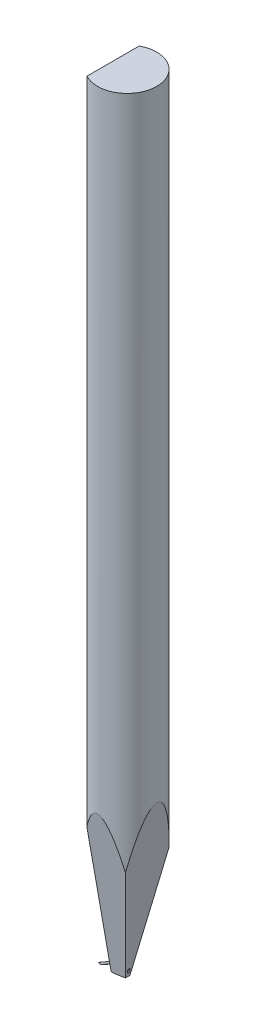
ISO-10303-21;
HEADER;
FILE_DESCRIPTION(('STEP AP214'),'2;1');
FILE_NAME('part.step','',(''),(''),'','','');
FILE_SCHEMA(('AUTOMOTIVE_DESIGN { 1 0 10303 214 1 1 1 1 }'));
ENDSEC;
DATA;
#1=APPLICATION_CONTEXT('core data for automotive mechanical design processes');
#2=APPLICATION_PROTOCOL_DEFINITION('international standard','automotive_design',2000,#1);
#3=PRODUCT_CONTEXT('',#1,'mechanical');
#4=PRODUCT('Part','Part','',(#3));
#5=PRODUCT_RELATED_PRODUCT_CATEGORY('part','',(#4));
#6=PRODUCT_DEFINITION_FORMATION('','',#4);
#7=PRODUCT_DEFINITION_CONTEXT('part definition',#1,'design');
#8=PRODUCT_DEFINITION('design','',#6,#7);
#9=PRODUCT_DEFINITION_SHAPE('','',#8);
#10=(LENGTH_UNIT() NAMED_UNIT(*) SI_UNIT(.MILLI.,.METRE.));
#11=(NAMED_UNIT(*) PLANE_ANGLE_UNIT() SI_UNIT($,.RADIAN.));
#12=(NAMED_UNIT(*) SI_UNIT($,.STERADIAN.) SOLID_ANGLE_UNIT());
#13=UNCERTAINTY_MEASURE_WITH_UNIT(LENGTH_MEASURE(1.E-05),#10,'distance_accuracy_value','');
#14=(GEOMETRIC_REPRESENTATION_CONTEXT(3) GLOBAL_UNCERTAINTY_ASSIGNED_CONTEXT((#13)) GLOBAL_UNIT_ASSIGNED_CONTEXT((#10,
#11,#12)) REPRESENTATION_CONTEXT('',''));
#15=CARTESIAN_POINT('',(0.,0.,0.));
#16=DIRECTION('',(0.,0.,1.));
#17=DIRECTION('',(1.,0.,0.));
#18=AXIS2_PLACEMENT_3D('',#15,#16,#17);
#19=CARTESIAN_POINT('',(-0.794583694095366,-0.0538815367264149,0.));
#20=DIRECTION('',(0.866025403784441,0.499999999999995,0.));
#21=DIRECTION('',(-0.499999999999995,0.866025403784441,0.));
#22=AXIS2_PLACEMENT_3D('',#19,#20,#21);
#23=CYLINDRICAL_SURFACE('',#22,0.0254000000000001);
#24=CARTESIAN_POINT('',(-0.701258134895325,0.,0.));
#25=DIRECTION('',(0.,1.,0.));
#26=DIRECTION('',(1.,0.,0.));
#27=AXIS2_PLACEMENT_3D('',#24,#25,#26);
#28=ELLIPSE('',#27,0.0508000000000007,0.0254000000000001);
#29=CARTESIAN_POINT('',(-0.650458134895325,0.,0.));
#30=VERTEX_POINT('',#29);
#31=EDGE_CURVE('E11',#30,#30,#28,.F.);
#32=ORIENTED_EDGE('',*,*,#31,.F.);
#33=EDGE_LOOP('',(#32));
#34=FACE_BOUND('',#33,.T.);
#35=CARTESIAN_POINT('',(-0.397417456991078,0.175422497178774,0.));
#36=DIRECTION('',(0.866025403784442,0.499999999999995,0.));
#37=DIRECTION('',(-0.499999999999995,0.866025403784442,0.));
#38=AXIS2_PLACEMENT_3D('',#35,#36,#37);
#39=CIRCLE('',#38,0.0254000000000001);
#40=CARTESIAN_POINT('',(-0.410117456991077,0.197419542434898,0.));
#41=VERTEX_POINT('',#40);
#42=EDGE_CURVE('E58',#41,#41,#39,.T.);
#43=ORIENTED_EDGE('',*,*,#42,.F.);
#44=EDGE_LOOP('',(#43));
#45=FACE_BOUND('',#44,.T.);
#46=ADVANCED_FACE('F52',(#34,#45),#23,.T.);
#47=CARTESIAN_POINT('',(-0.397417456991078,0.175422497178774,0.));
#48=DIRECTION('',(0.866025403784442,0.499999999999995,0.));
#49=DIRECTION('',(-0.499999999999995,0.866025403784442,0.));
#50=AXIS2_PLACEMENT_3D('',#47,#48,#49);
#51=PLANE('',#50);
#52=ORIENTED_EDGE('',*,*,#42,.T.);
#53=EDGE_LOOP('',(#52));
#54=FACE_BOUND('',#53,.T.);
#55=ADVANCED_FACE('F64',(#54),#51,.T.);
#56=CARTESIAN_POINT('',(0.,0.,0.));
#57=DIRECTION('',(0.,1.,0.));
#58=DIRECTION('',(0.,0.,1.));
#59=AXIS2_PLACEMENT_3D('',#56,#57,#58);
#60=PLANE('',#59);
#61=ORIENTED_EDGE('',*,*,#31,.T.);
#62=EDGE_LOOP('',(#61));
#63=FACE_BOUND('',#62,.T.);
#64=ADVANCED_FACE('F71',(#63),#60,.F.);
#65=CLOSED_SHELL('',(#46,#55,#64));
#66=MANIFOLD_SOLID_BREP('B2',#65);
#67=CARTESIAN_POINT('',(26.8738719491216,0.,0.0508));
#68=DIRECTION('',(0.,-0.173648177666931,0.984807753012208));
#69=DIRECTION('',(0.,-0.984807753012208,-0.173648177666931));
#70=AXIS2_PLACEMENT_3D('',#67,#68,#69);
#71=PLANE('',#70);
#72=CARTESIAN_POINT('',(-0.3480816,0.02794,0.0557265758409954));
#73=DIRECTION('',(0.,-0.173648177666931,0.984807753012208));
#74=DIRECTION('',(0.,-0.984807753012208,-0.173648177666931));
#75=AXIS2_PLACEMENT_3D('',#72,#73,#74);
#76=ELLIPSE('',#75,0.0283710195360877,0.02794);
#77=CARTESIAN_POINT('',(-0.3480816,0.,0.0508000000000009));
#78=VERTEX_POINT('',#77);
#79=CARTESIAN_POINT('',(-0.37592,0.0255594358987837,0.0553068181606436));
#80=VERTEX_POINT('',#79);
#81=EDGE_CURVE('E123',#78,#80,#76,.F.);
#82=ORIENTED_EDGE('',*,*,#81,.F.);
#83=DIRECTION('',(-1.,0.,0.));
#84=VECTOR('',#83,1.);
#85=CARTESIAN_POINT('',(26.8738719491216,0.,0.0508));
#86=LINE('',#85,#84);
#87=CARTESIAN_POINT('',(-0.287019999999996,0.,0.0508));
#88=VERTEX_POINT('',#87);
#89=EDGE_CURVE('E423',#88,#78,#86,.T.);
#90=ORIENTED_EDGE('',*,*,#89,.F.);
#91=DIRECTION('',(-0.984346441568213,-0.173566836012845,-0.0306045161452665));
#92=VECTOR('',#91,1.);
#93=CARTESIAN_POINT('',(26.0301980698046,4.64043560289492,0.869033999030531));
#94=LINE('',#93,#92);
#95=CARTESIAN_POINT('',(0.0144531636701099,0.0531578527145794,0.060173163670107));
#96=VERTEX_POINT('',#95);
#97=EDGE_CURVE('E414',#96,#88,#94,.T.);
#98=ORIENTED_EDGE('',*,*,#97,.F.);
#99=DIRECTION('',(-0.171087869746036,-0.970287525247814,-0.171087869746036));
#100=VECTOR('',#99,1.);
#101=CARTESIAN_POINT('',(0.791557999082992,4.46033837772866,0.837277999082991));
#102=LINE('',#101,#100);
#103=CARTESIAN_POINT('',(0.537041505266774,3.0169036135559,0.582761505266773));
#104=VERTEX_POINT('',#103);
#105=EDGE_CURVE('E409',#104,#96,#102,.T.);
#106=ORIENTED_EDGE('',*,*,#105,.F.);
#107=CARTESIAN_POINT('',(0.,-0.288101116436578,0.));
#108=DIRECTION('',(0.,-0.173648177666931,0.984807753012208));
#109=DIRECTION('',(0.,-0.984807753012208,-0.173648177666931));
#110=AXIS2_PLACEMENT_3D('',#107,#108,#109);
#111=ELLIPSE('',#110,4.56371043248163,0.792479999999998);
#112=CARTESIAN_POINT('',(-0.37592,3.66844093071415,0.69764511322018));
#113=VERTEX_POINT('',#112);
#114=EDGE_CURVE('E428',#104,#113,#111,.T.);
#115=ORIENTED_EDGE('',*,*,#114,.T.);
#116=DIRECTION('',(0.,0.984807753012208,0.173648177666931));
#117=VECTOR('',#116,1.);
#118=CARTESIAN_POINT('',(-0.37592,20.251112252608,3.62161747949059));
#119=LINE('',#118,#117);
#120=EDGE_CURVE('E109',#80,#113,#119,.T.);
#121=ORIENTED_EDGE('',*,*,#120,.F.);
#122=EDGE_LOOP('',(#82,#90,#98,#106,#115,#121));
#123=FACE_BOUND('',#122,.T.);
#124=ADVANCED_FACE('F101',(#123),#71,.T.);
#125=CARTESIAN_POINT('',(26.8738719491216,0.,-0.0508));
#126=DIRECTION('',(0.,-0.173648177666931,-0.984807753012208));
#127=DIRECTION('',(0.,0.984807753012208,-0.173648177666931));
#128=AXIS2_PLACEMENT_3D('',#125,#126,#127);
#129=PLANE('',#128);
#130=CARTESIAN_POINT('',(-0.3480816,0.02794,-0.0557265758409954));
#131=DIRECTION('',(0.,-0.173648177666931,-0.984807753012208));
#132=DIRECTION('',(0.,0.984807753012208,-0.173648177666931));
#133=AXIS2_PLACEMENT_3D('',#130,#131,#132);
#134=ELLIPSE('',#133,0.0283710195360877,0.02794);
#135=CARTESIAN_POINT('',(-0.37592,0.0255594358987803,-0.055306818160644));
#136=VERTEX_POINT('',#135);
#137=CARTESIAN_POINT('',(-0.3480816,0.,-0.0508000000000009));
#138=VERTEX_POINT('',#137);
#139=EDGE_CURVE('E238',#136,#138,#134,.F.);
#140=ORIENTED_EDGE('',*,*,#139,.F.);
#141=DIRECTION('',(0.,-0.984807753012208,0.173648177666931));
#142=VECTOR('',#141,1.);
#143=CARTESIAN_POINT('',(-0.37592,20.5255765703836,-3.67001294395617));
#144=LINE('',#143,#142);
#145=CARTESIAN_POINT('',(-0.37592,3.66844093071414,-0.69764511322018));
#146=VERTEX_POINT('',#145);
#147=EDGE_CURVE('E234',#146,#136,#144,.T.);
#148=ORIENTED_EDGE('',*,*,#147,.F.);
#149=CARTESIAN_POINT('',(0.,-0.288101116436578,0.));
#150=DIRECTION('',(0.,-0.173648177666931,-0.984807753012208));
#151=DIRECTION('',(0.,-0.984807753012208,0.173648177666931));
#152=AXIS2_PLACEMENT_3D('',#149,#150,#151);
#153=ELLIPSE('',#152,4.56371043248163,0.792479999999998);
#154=CARTESIAN_POINT('',(0.537041505266774,3.0169036135559,-0.582761505266773));
#155=VERTEX_POINT('',#154);
#156=EDGE_CURVE('E431',#146,#155,#153,.T.);
#157=ORIENTED_EDGE('',*,*,#156,.T.);
#158=DIRECTION('',(0.171087869746036,0.970287525247814,-0.171087869746036));
#159=VECTOR('',#158,1.);
#160=CARTESIAN_POINT('',(0.791557999082992,4.46033837772866,-0.837277999082991));
#161=LINE('',#160,#159);
#162=CARTESIAN_POINT('',(0.0144531636701099,0.0531578527145794,-0.060173163670107));
#163=VERTEX_POINT('',#162);
#164=EDGE_CURVE('E274',#163,#155,#161,.T.);
#165=ORIENTED_EDGE('',*,*,#164,.F.);
#166=DIRECTION('',(0.984346441568213,0.173566836012845,-0.0306045161452665));
#167=VECTOR('',#166,1.);
#168=CARTESIAN_POINT('',(26.0301980698046,4.64043560289492,-0.869033999030531));
#169=LINE('',#168,#167);
#170=CARTESIAN_POINT('',(-0.287019999999996,0.,-0.0508));
#171=VERTEX_POINT('',#170);
#172=EDGE_CURVE('E281',#171,#163,#169,.T.);
#173=ORIENTED_EDGE('',*,*,#172,.F.);
#174=DIRECTION('',(-1.,0.,0.));
#175=VECTOR('',#174,1.);
#176=CARTESIAN_POINT('',(26.8738719491216,0.,-0.0508));
#177=LINE('',#176,#175);
#178=EDGE_CURVE('E425',#171,#138,#177,.T.);
#179=ORIENTED_EDGE('',*,*,#178,.T.);
#180=EDGE_LOOP('',(#140,#148,#157,#165,#173,#179));
#181=FACE_BOUND('',#180,.T.);
#182=ADVANCED_FACE('F342',(#181),#129,.T.);
#183=CARTESIAN_POINT('',(0.,0.,0.));
#184=DIRECTION('',(0.,1.,0.));
#185=DIRECTION('',(0.,0.,1.));
#186=AXIS2_PLACEMENT_3D('',#183,#184,#185);
#187=PLANE('',#186);
#188=ORIENTED_EDGE('',*,*,#89,.T.);
#189=DIRECTION('',(0.,0.,-1.));
#190=VECTOR('',#189,1.);
#191=CARTESIAN_POINT('',(-0.3480816,0.,26.4582199752761));
#192=LINE('',#191,#190);
#193=CARTESIAN_POINT('',(-0.348081599999987,0.,0.038143094613822));
#194=VERTEX_POINT('',#193);
#195=EDGE_CURVE('E491',#78,#194,#192,.T.);
#196=ORIENTED_EDGE('',*,*,#195,.T.);
#197=DIRECTION('',(-1.,0.,0.));
#198=VECTOR('',#197,1.);
#199=CARTESIAN_POINT('',(26.7627469491216,0.,0.038143094613822));
#200=LINE('',#199,#198);
#201=CARTESIAN_POINT('',(-0.28702,0.,0.0381430946138281));
#202=VERTEX_POINT('',#201);
#203=EDGE_CURVE('E303',#202,#194,#200,.T.);
#204=ORIENTED_EDGE('',*,*,#203,.F.);
#205=DIRECTION('',(0.,0.,-1.));
#206=VECTOR('',#205,1.);
#207=CARTESIAN_POINT('',(-0.28702,0.,27.2760283406468));
#208=LINE('',#207,#206);
#209=EDGE_CURVE('E412',#88,#202,#208,.T.);
#210=ORIENTED_EDGE('',*,*,#209,.F.);
#211=EDGE_LOOP('',(#188,#196,#204,#210));
#212=FACE_BOUND('',#211,.T.);
#213=ADVANCED_FACE('F351',(#212),#187,.F.);
#214=DIRECTION('',(-1.,0.,0.));
#215=VECTOR('',#214,1.);
#216=CARTESIAN_POINT('',(26.7627469491216,0.,-0.038143094613822));
#217=LINE('',#216,#215);
#218=CARTESIAN_POINT('',(-0.28702,0.,-0.0381430946138281));
#219=VERTEX_POINT('',#218);
#220=CARTESIAN_POINT('',(-0.348081600002256,0.,-0.038143094613822));
#221=VERTEX_POINT('',#220);
#222=EDGE_CURVE('E457',#219,#221,#217,.T.);
#223=ORIENTED_EDGE('',*,*,#222,.T.);
#224=EDGE_CURVE('E490',#221,#138,#192,.T.);
#225=ORIENTED_EDGE('',*,*,#224,.T.);
#226=ORIENTED_EDGE('',*,*,#178,.F.);
#227=EDGE_CURVE('E417',#219,#171,#208,.T.);
#228=ORIENTED_EDGE('',*,*,#227,.F.);
#229=EDGE_LOOP('',(#223,#225,#226,#228));
#230=FACE_BOUND('',#229,.T.);
#231=ADVANCED_FACE('F348',(#230),#187,.F.);
#232=CARTESIAN_POINT('',(-0.28702,0.,27.2760283406468));
#233=DIRECTION('',(-0.173648177666931,0.984807753012208,0.));
#234=DIRECTION('',(-0.984807753012208,-0.173648177666931,0.));
#235=AXIS2_PLACEMENT_3D('',#232,#233,#234);
#236=PLANE('',#235);
#237=ORIENTED_EDGE('',*,*,#209,.T.);
#238=CARTESIAN_POINT('',(-1.63100018413197,-0.236979968,0.));
#239=DIRECTION('',(-0.173648177666931,0.984807753012208,0.));
#240=DIRECTION('',(-0.984807753012208,-0.173648177666931,0.));
#241=AXIS2_PLACEMENT_3D('',#238,#239,#240);
#242=ELLIPSE('',#241,1.38227767906896,0.24003);
#243=CARTESIAN_POINT('',(-0.277365588744476,0.00170233318718376,0.0253999999999992));
#244=VERTEX_POINT('',#243);
#245=EDGE_CURVE('E462',#202,#244,#242,.T.);
#246=ORIENTED_EDGE('',*,*,#245,.T.);
#247=DIRECTION('',(-0.984807753012208,-0.173648177666931,0.));
#248=VECTOR('',#247,1.);
#249=CARTESIAN_POINT('',(-0.28702,0.,0.0253999999999983));
#250=LINE('',#249,#248);
#251=CARTESIAN_POINT('',(-0.12192,0.0291115845149677,0.0253999999999992));
#252=VERTEX_POINT('',#251);
#253=EDGE_CURVE('E294',#252,#244,#250,.T.);
#254=ORIENTED_EDGE('',*,*,#253,.F.);
#255=DIRECTION('',(0.,0.,1.));
#256=VECTOR('',#255,1.);
#257=CARTESIAN_POINT('',(-0.12192,0.0291115845149677,27.2760283406468));
#258=LINE('',#257,#256);
#259=CARTESIAN_POINT('',(-0.12192,0.0291115845149677,-0.0253999999999992));
#260=VERTEX_POINT('',#259);
#261=EDGE_CURVE('E292',#260,#252,#258,.T.);
#262=ORIENTED_EDGE('',*,*,#261,.F.);
#263=DIRECTION('',(-0.984807753012208,-0.173648177666931,0.));
#264=VECTOR('',#263,1.);
#265=CARTESIAN_POINT('',(-0.28702,0.,-0.0253999999999983));
#266=LINE('',#265,#264);
#267=CARTESIAN_POINT('',(-0.277365588744476,0.00170233318718376,-0.0253999999999992));
#268=VERTEX_POINT('',#267);
#269=EDGE_CURVE('E284',#260,#268,#266,.T.);
#270=ORIENTED_EDGE('',*,*,#269,.T.);
#271=EDGE_CURVE('E460',#268,#219,#242,.T.);
#272=ORIENTED_EDGE('',*,*,#271,.T.);
#273=ORIENTED_EDGE('',*,*,#227,.T.);
#274=ORIENTED_EDGE('',*,*,#172,.T.);
#275=DIRECTION('',(0.,0.,-1.));
#276=VECTOR('',#275,1.);
#277=CARTESIAN_POINT('',(0.014453163670107,0.0531578527145792,27.2760283406468));
#278=LINE('',#277,#276);
#279=EDGE_CURVE('E288',#96,#163,#278,.T.);
#280=ORIENTED_EDGE('',*,*,#279,.F.);
#281=ORIENTED_EDGE('',*,*,#97,.T.);
#282=EDGE_LOOP('',(#237,#246,#254,#262,#270,#272,#273,#274,#280,#281));
#283=FACE_BOUND('',#282,.T.);
#284=ADVANCED_FACE('F350',(#283),#236,.F.);
#285=CARTESIAN_POINT('',(0.,21.0312,0.));
#286=DIRECTION('',(0.,-1.,0.));
#287=DIRECTION('',(0.,0.,-1.));
#288=AXIS2_PLACEMENT_3D('',#285,#286,#287);
#289=CYLINDRICAL_SURFACE('',#288,0.792479999999998);
#290=ORIENTED_EDGE('',*,*,#114,.F.);
#291=CARTESIAN_POINT('',(0.,-0.0288101116436568,0.));
#292=DIRECTION('',(-0.984807753012208,0.173648177666931,0.));
#293=DIRECTION('',(-0.173648177666931,-0.984807753012208,0.));
#294=AXIS2_PLACEMENT_3D('',#291,#292,#293);
#295=ELLIPSE('',#294,4.56371043248164,0.792479999999998);
#296=EDGE_CURVE('E407',#104,#155,#295,.T.);
#297=ORIENTED_EDGE('',*,*,#296,.T.);
#298=ORIENTED_EDGE('',*,*,#156,.F.);
#299=DIRECTION('',(0.,-1.,0.));
#300=VECTOR('',#299,1.);
#301=CARTESIAN_POINT('',(-0.37592,21.0312,-0.69764511322018));
#302=LINE('',#301,#300);
#303=CARTESIAN_POINT('',(-0.37592,21.0312,-0.69764511322018));
#304=VERTEX_POINT('',#303);
#305=EDGE_CURVE('E437',#304,#146,#302,.T.);
#306=ORIENTED_EDGE('',*,*,#305,.F.);
#307=CARTESIAN_POINT('',(0.,21.0312,0.));
#308=DIRECTION('',(0.,1.,0.));
#309=DIRECTION('',(0.,0.,1.));
#310=AXIS2_PLACEMENT_3D('',#307,#308,#309);
#311=CIRCLE('',#310,0.792479999999998);
#312=CARTESIAN_POINT('',(-0.37592,21.0312,0.69764511322018));
#313=VERTEX_POINT('',#312);
#314=EDGE_CURVE('E438',#313,#304,#311,.T.);
#315=ORIENTED_EDGE('',*,*,#314,.F.);
#316=DIRECTION('',(0.,-1.,0.));
#317=VECTOR('',#316,1.);
#318=CARTESIAN_POINT('',(-0.37592,21.0312,0.69764511322018));
#319=LINE('',#318,#317);
#320=EDGE_CURVE('E435',#113,#313,#319,.F.);
#321=ORIENTED_EDGE('',*,*,#320,.F.);
#322=EDGE_LOOP('',(#290,#297,#298,#306,#315,#321));
#323=FACE_BOUND('',#322,.T.);
#324=ADVANCED_FACE('F341',(#323),#289,.T.);
#325=CARTESIAN_POINT('',(-0.37592,21.0312,-0.80247998));
#326=DIRECTION('',(-1.,0.,0.));
#327=DIRECTION('',(0.,0.,1.));
#328=AXIS2_PLACEMENT_3D('',#325,#326,#327);
#329=PLANE('',#328);
#330=CARTESIAN_POINT('',(-0.37592,0.,0.0381430946138219));
#331=CARTESIAN_POINT('',(-0.37592,0.0144535575882574,0.0276430142187345));
#332=CARTESIAN_POINT('',(-0.37592,0.0284500319999992,0.014118246623183));
#333=CARTESIAN_POINT('',(-0.37592,0.0284500319999992,-0.0141182466231834));
#334=CARTESIAN_POINT('',(-0.37592,0.0144535575882874,-0.0276430142187765));
#335=CARTESIAN_POINT('',(-0.37592,0.,-0.0381430946138219));
#336=(BOUNDED_CURVE() B_SPLINE_CURVE(3,(#330,#331,#332,#333,#334,#335),.UNSPECIFIED.,.F.,
.F.) B_SPLINE_CURVE_WITH_KNOTS((4,2,4),(1.41121010770958,1.5707963267949,1.73038254588021),
.UNSPECIFIED.) CURVE() GEOMETRIC_REPRESENTATION_ITEM() RATIONAL_B_SPLINE_CURVE((1.,1.,1.,1.,1.,1.)) REPRESENTATION_ITEM(''));
#337=CARTESIAN_POINT('',(-0.375920000000971,0.0255596480208407,-0.011378727190152));
#338=VERTEX_POINT('',#337);
#339=CARTESIAN_POINT('',(-0.375920000000209,0.0255596690697592,0.0115324538400817));
#340=VERTEX_POINT('',#339);
#341=EDGE_CURVE('E221',#338,#340,#336,.F.);
#342=ORIENTED_EDGE('',*,*,#341,.T.);
#343=DIRECTION('',(0.,0.,-1.));
#344=VECTOR('',#343,1.);
#345=CARTESIAN_POINT('',(-0.37592,0.0255594358987817,26.4582199752761));
#346=LINE('',#345,#344);
#347=EDGE_CURVE('E131',#80,#340,#346,.T.);
#348=ORIENTED_EDGE('',*,*,#347,.F.);
#349=ORIENTED_EDGE('',*,*,#120,.T.);
#350=ORIENTED_EDGE('',*,*,#320,.T.);
#351=DIRECTION('',(0.,0.,-1.));
#352=VECTOR('',#351,1.);
#353=CARTESIAN_POINT('',(-0.37592,21.0312,-0.80247998));
#354=LINE('',#353,#352);
#355=EDGE_CURVE('E433',#313,#304,#354,.T.);
#356=ORIENTED_EDGE('',*,*,#355,.T.);
#357=ORIENTED_EDGE('',*,*,#305,.T.);
#358=ORIENTED_EDGE('',*,*,#147,.T.);
#359=EDGE_CURVE('E231',#338,#136,#346,.T.);
#360=ORIENTED_EDGE('',*,*,#359,.F.);
#361=EDGE_LOOP('',(#342,#348,#349,#350,#356,#357,#358,#360));
#362=FACE_BOUND('',#361,.T.);
#363=ADVANCED_FACE('F232',(#362),#329,.T.);
#364=CARTESIAN_POINT('',(0.,21.0312,0.));
#365=DIRECTION('',(0.,1.,0.));
#366=DIRECTION('',(0.,0.,1.));
#367=AXIS2_PLACEMENT_3D('',#364,#365,#366);
#368=PLANE('',#367);
#369=ORIENTED_EDGE('',*,*,#314,.T.);
#370=ORIENTED_EDGE('',*,*,#355,.F.);
#371=EDGE_LOOP('',(#369,#370));
#372=FACE_BOUND('',#371,.T.);
#373=ADVANCED_FACE('F340',(#372),#368,.T.);
#374=CARTESIAN_POINT('',(0.014453163670107,0.0531578527145792,27.2760283406468));
#375=DIRECTION('',(-0.984807753012208,0.173648177666931,0.));
#376=DIRECTION('',(-0.173648177666931,-0.984807753012208,0.));
#377=AXIS2_PLACEMENT_3D('',#374,#375,#376);
#378=PLANE('',#377);
#379=CARTESIAN_POINT('',(0.041004814353714,0.203739746517359,0.));
#380=DIRECTION('',(-0.984807753012208,0.173648177666931,0.));
#381=DIRECTION('',(0.173648177666931,0.984807753012208,0.));
#382=AXIS2_PLACEMENT_3D('',#379,#380,#381);
#383=ELLIPSE('',#382,0.0510507152050236,0.0366689973897193);
#384=CARTESIAN_POINT('',(0.0498696780176598,0.254014886648085,0.));
#385=VERTEX_POINT('',#384);
#386=EDGE_CURVE('E285',#385,#385,#383,.F.);
#387=ORIENTED_EDGE('',*,*,#386,.F.);
#388=EDGE_LOOP('',(#387));
#389=FACE_BOUND('',#388,.T.);
#390=ORIENTED_EDGE('',*,*,#296,.F.);
#391=ORIENTED_EDGE('',*,*,#105,.T.);
#392=ORIENTED_EDGE('',*,*,#279,.T.);
#393=ORIENTED_EDGE('',*,*,#164,.T.);
#394=EDGE_LOOP('',(#390,#391,#392,#393));
#395=FACE_BOUND('',#394,.T.);
#396=ADVANCED_FACE('F346',(#389,#395),#378,.F.);
#397=CARTESIAN_POINT('',(-0.12192,0.0939800000000001,0.0254));
#398=DIRECTION('',(-1.,0.,0.));
#399=DIRECTION('',(0.,0.,1.));
#400=AXIS2_PLACEMENT_3D('',#397,#398,#399);
#401=PLANE('',#400);
#402=ORIENTED_EDGE('',*,*,#261,.T.);
#403=DIRECTION('',(0.,1.,0.));
#404=VECTOR('',#403,1.);
#405=CARTESIAN_POINT('',(-0.12192,0.0939800000000001,0.0254));
#406=LINE('',#405,#404);
#407=CARTESIAN_POINT('',(-0.12192,0.0939800000000001,0.0254));
#408=VERTEX_POINT('',#407);
#409=EDGE_CURVE('E477',#252,#408,#406,.T.);
#410=ORIENTED_EDGE('',*,*,#409,.T.);
#411=CARTESIAN_POINT('',(-0.12192,0.0939800000000001,0.));
#412=DIRECTION('',(1.,0.,0.));
#413=DIRECTION('',(0.,1.,0.));
#414=AXIS2_PLACEMENT_3D('',#411,#412,#413);
#415=ELLIPSE('',#414,0.0293293936748329,0.0254);
#416=CARTESIAN_POINT('',(-0.12192,0.0939800000000001,-0.0253999999999983));
#417=VERTEX_POINT('',#416);
#418=EDGE_CURVE('E467',#417,#408,#415,.F.);
#419=ORIENTED_EDGE('',*,*,#418,.F.);
#420=DIRECTION('',(0.,1.,0.));
#421=VECTOR('',#420,1.);
#422=CARTESIAN_POINT('',(-0.12192,0.0939800000000001,-0.0254));
#423=LINE('',#422,#421);
#424=EDGE_CURVE('E475',#260,#417,#423,.T.);
#425=ORIENTED_EDGE('',*,*,#424,.F.);
#426=EDGE_LOOP('',(#402,#410,#419,#425));
#427=FACE_BOUND('',#426,.T.);
#428=ADVANCED_FACE('F369',(#427),#401,.T.);
#429=CARTESIAN_POINT('',(0.,0.,0.0254));
#430=DIRECTION('',(0.,0.,-1.));
#431=DIRECTION('',(-1.,0.,0.));
#432=AXIS2_PLACEMENT_3D('',#429,#430,#431);
#433=PLANE('',#432);
#434=DIRECTION('',(-1.,0.,0.));
#435=VECTOR('',#434,1.);
#436=CARTESIAN_POINT('',(26.7627469491216,0.00170233318716383,0.0254));
#437=LINE('',#436,#435);
#438=CARTESIAN_POINT('',(-0.311437157476142,0.00170233318716177,0.0254));
#439=VERTEX_POINT('',#438);
#440=EDGE_CURVE('E456',#439,#244,#437,.F.);
#441=ORIENTED_EDGE('',*,*,#440,.F.);
#442=DIRECTION('',(-0.500000000000004,-0.866025403784436,0.));
#443=VECTOR('',#442,1.);
#444=CARTESIAN_POINT('',(-0.31242,0.,0.0254));
#445=LINE('',#444,#443);
#446=CARTESIAN_POINT('',(-0.258160621701558,0.0939800000000001,0.0254));
#447=VERTEX_POINT('',#446);
#448=EDGE_CURVE('E474',#447,#439,#445,.T.);
#449=ORIENTED_EDGE('',*,*,#448,.F.);
#450=DIRECTION('',(-1.,0.,0.));
#451=VECTOR('',#450,1.);
#452=CARTESIAN_POINT('',(-0.258160621701558,0.0939800000000001,0.0254));
#453=LINE('',#452,#451);
#454=EDGE_CURVE('E471',#408,#447,#453,.T.);
#455=ORIENTED_EDGE('',*,*,#454,.F.);
#456=ORIENTED_EDGE('',*,*,#409,.F.);
#457=ORIENTED_EDGE('',*,*,#253,.T.);
#458=EDGE_LOOP('',(#441,#449,#455,#456,#457));
#459=FACE_BOUND('',#458,.T.);
#460=ADVANCED_FACE('F383',(#459),#433,.T.);
#461=CARTESIAN_POINT('',(0.,0.,-0.0254));
#462=DIRECTION('',(0.,0.,-1.));
#463=DIRECTION('',(-1.,0.,0.));
#464=AXIS2_PLACEMENT_3D('',#461,#462,#463);
#465=PLANE('',#464);
#466=DIRECTION('',(-0.500000000000004,-0.866025403784436,0.));
#467=VECTOR('',#466,1.);
#468=CARTESIAN_POINT('',(-0.31242,0.,-0.0254));
#469=LINE('',#468,#467);
#470=CARTESIAN_POINT('',(-0.258160621701558,0.0939800000000001,-0.0254));
#471=VERTEX_POINT('',#470);
#472=CARTESIAN_POINT('',(-0.311437157476142,0.00170233318716177,-0.0254));
#473=VERTEX_POINT('',#472);
#474=EDGE_CURVE('E481',#471,#473,#469,.T.);
#475=ORIENTED_EDGE('',*,*,#474,.T.);
#476=DIRECTION('',(-1.,0.,0.));
#477=VECTOR('',#476,1.);
#478=CARTESIAN_POINT('',(26.7627469491216,0.00170233318716383,-0.0254));
#479=LINE('',#478,#477);
#480=EDGE_CURVE('E454',#473,#268,#479,.F.);
#481=ORIENTED_EDGE('',*,*,#480,.T.);
#482=ORIENTED_EDGE('',*,*,#269,.F.);
#483=ORIENTED_EDGE('',*,*,#424,.T.);
#484=DIRECTION('',(-1.,0.,0.));
#485=VECTOR('',#484,1.);
#486=CARTESIAN_POINT('',(-0.258160621701558,0.0939800000000001,-0.0254));
#487=LINE('',#486,#485);
#488=EDGE_CURVE('E470',#417,#471,#487,.T.);
#489=ORIENTED_EDGE('',*,*,#488,.T.);
#490=EDGE_LOOP('',(#475,#481,#482,#483,#489));
#491=FACE_BOUND('',#490,.T.);
#492=ADVANCED_FACE('F385',(#491),#465,.F.);
#493=CARTESIAN_POINT('',(0.0191425430089225,0.175422497178774,0.));
#494=DIRECTION('',(0.866025403784441,0.499999999999995,0.));
#495=DIRECTION('',(-0.499999999999995,0.866025403784441,0.));
#496=AXIS2_PLACEMENT_3D('',#493,#494,#495);
#497=CONICAL_SURFACE('',#496,0.0254,0.392699081698725);
#498=CARTESIAN_POINT('',(0.0191425430089225,0.175422497178774,0.));
#499=DIRECTION('',(0.866025403784441,0.499999999999995,0.));
#500=DIRECTION('',(-0.499999999999995,0.866025403784441,0.));
#501=AXIS2_PLACEMENT_3D('',#498,#499,#500);
#502=CIRCLE('',#501,0.0254);
#503=CARTESIAN_POINT('',(0.00644254300892263,0.197419542434898,0.));
#504=VERTEX_POINT('',#503);
#505=EDGE_CURVE('E401',#504,#504,#502,.T.);
#506=ORIENTED_EDGE('',*,*,#505,.F.);
#507=EDGE_LOOP('',(#506));
#508=FACE_BOUND('',#507,.T.);
#509=ORIENTED_EDGE('',*,*,#386,.T.);
#510=EDGE_LOOP('',(#509));
#511=FACE_BOUND('',#510,.T.);
#512=ADVANCED_FACE('F375',(#508,#511),#497,.F.);
#513=CARTESIAN_POINT('',(-0.258160621701558,0.0939800000000001,0.0254));
#514=DIRECTION('',(0.,-1.,0.));
#515=DIRECTION('',(0.,0.,-1.));
#516=AXIS2_PLACEMENT_3D('',#513,#514,#515);
#517=PLANE('',#516);
#518=ORIENTED_EDGE('',*,*,#454,.T.);
#519=DIRECTION('',(0.,0.,-1.));
#520=VECTOR('',#519,1.);
#521=CARTESIAN_POINT('',(-0.258160621701558,0.0939800000000001,0.0254));
#522=LINE('',#521,#520);
#523=EDGE_CURVE('E289',#447,#471,#522,.T.);
#524=ORIENTED_EDGE('',*,*,#523,.T.);
#525=ORIENTED_EDGE('',*,*,#488,.F.);
#526=CARTESIAN_POINT('',(-0.12192,0.0939800000000001,0.));
#527=DIRECTION('',(0.,1.,0.));
#528=DIRECTION('',(1.,0.,0.));
#529=AXIS2_PLACEMENT_3D('',#526,#527,#528);
#530=ELLIPSE('',#529,0.0508000000000005,0.0254);
#531=EDGE_CURVE('E464',#408,#417,#530,.F.);
#532=ORIENTED_EDGE('',*,*,#531,.F.);
#533=EDGE_LOOP('',(#518,#524,#525,#532));
#534=FACE_BOUND('',#533,.T.);
#535=ADVANCED_FACE('F371',(#534),#517,.T.);
#536=CARTESIAN_POINT('',(-0.31242,0.,0.0254));
#537=DIRECTION('',(0.866025403784436,-0.500000000000004,0.));
#538=DIRECTION('',(0.500000000000004,0.866025403784436,0.));
#539=AXIS2_PLACEMENT_3D('',#536,#537,#538);
#540=PLANE('',#539);
#541=CARTESIAN_POINT('',(-0.449240448317356,-0.236979968,0.));
#542=DIRECTION('',(0.866025403784436,-0.500000000000004,0.));
#543=DIRECTION('',(-0.500000000000004,-0.866025403784436,0.));
#544=AXIS2_PLACEMENT_3D('',#541,#542,#543);
#545=ELLIPSE('',#544,0.277162770227172,0.24003);
#546=EDGE_CURVE('E297',#473,#439,#545,.T.);
#547=ORIENTED_EDGE('',*,*,#546,.F.);
#548=ORIENTED_EDGE('',*,*,#474,.F.);
#549=ORIENTED_EDGE('',*,*,#523,.F.);
#550=ORIENTED_EDGE('',*,*,#448,.T.);
#551=EDGE_LOOP('',(#547,#548,#549,#550));
#552=FACE_BOUND('',#551,.T.);
#553=ADVANCED_FACE('F374',(#552),#540,.T.);
#554=CARTESIAN_POINT('',(-0.378023694095365,-0.0538815367264147,0.));
#555=DIRECTION('',(0.866025403784441,0.499999999999995,0.));
#556=DIRECTION('',(-0.499999999999995,0.866025403784441,0.));
#557=AXIS2_PLACEMENT_3D('',#554,#555,#556);
#558=CYLINDRICAL_SURFACE('',#557,0.0254);
#559=ORIENTED_EDGE('',*,*,#418,.T.);
#560=ORIENTED_EDGE('',*,*,#531,.T.);
#561=EDGE_LOOP('',(#559,#560));
#562=FACE_BOUND('',#561,.T.);
#563=ORIENTED_EDGE('',*,*,#505,.T.);
#564=EDGE_LOOP('',(#563));
#565=FACE_BOUND('',#564,.T.);
#566=ADVANCED_FACE('F379',(#562,#565),#558,.F.);
#567=CARTESIAN_POINT('',(26.7627469491216,-0.236979968,0.));
#568=DIRECTION('',(-1.,0.,0.));
#569=DIRECTION('',(0.,0.,1.));
#570=AXIS2_PLACEMENT_3D('',#567,#568,#569);
#571=CYLINDRICAL_SURFACE('',#570,0.24003);
#572=ORIENTED_EDGE('',*,*,#203,.T.);
#573=CARTESIAN_POINT('',(-0.3480816,0.,0.038143094613815));
#574=CARTESIAN_POINT('',(-0.348369714321103,-1.56935028105332E-07,0.0381439750406092));
#575=CARTESIAN_POINT('',(-0.348656573425273,4.45005958376527E-06,0.0381154521883494));
#576=CARTESIAN_POINT('',(-0.349216563385699,2.17175153585786E-05,0.0380079816676392));
#577=CARTESIAN_POINT('',(-0.349489828077256,3.42673365634992E-05,0.0379297266843253));
#578=CARTESIAN_POINT('',(-0.350082900446083,6.98058538342368E-05,0.0377070299900413));
#579=CARTESIAN_POINT('',(-0.350398247305199,9.45712833188038E-05,0.0375512480762041));
#580=CARTESIAN_POINT('',(-0.351000817189614,0.000151265402800817,0.037191569407843));
#581=CARTESIAN_POINT('',(-0.351287871025177,0.000183233823173384,0.0369874054506203));
#582=CARTESIAN_POINT('',(-0.352020676195308,0.000275152053315565,0.0363943412781914));
#583=CARTESIAN_POINT('',(-0.352440638701963,0.000339281953909106,0.0359746161770599));
#584=CARTESIAN_POINT('',(-0.353215903284732,0.000473024605118936,0.0350811459343368));
#585=CARTESIAN_POINT('',(-0.353571067845606,0.000542648577198203,0.0346072892989668));
#586=CARTESIAN_POINT('',(-0.354796034626167,0.000802949464012375,0.0327939065323286));
#587=CARTESIAN_POINT('',(-0.355512836955977,0.000997959619272968,0.031353757205377));
#588=CARTESIAN_POINT('',(-0.35674555408746,0.00137018433770622,0.028388729805797));
#589=CARTESIAN_POINT('',(-0.357260214897153,0.00154728290801335,0.0268633878653488));
#590=CARTESIAN_POINT('',(-0.358977790680213,0.00217412345863165,0.0209480350343973));
#591=CARTESIAN_POINT('',(-0.359719958129616,0.0025307524687309,0.0164164083318388));
#592=CARTESIAN_POINT('',(-0.360648052549157,0.00298358142968348,0.00729077616680531));
#593=CARTESIAN_POINT('',(-0.360831994758565,0.00307885200991782,0.00269660632901545));
#594=CARTESIAN_POINT('',(-0.360699101766432,0.00301114757696837,-0.00586724233541038));
#595=CARTESIAN_POINT('',(-0.360446205292645,0.00288113762753802,-0.00983792491480359));
#596=CARTESIAN_POINT('',(-0.359491503722969,0.00242865634703319,-0.0176962772820105));
#597=CARTESIAN_POINT('',(-0.35879302911546,0.00210761408036782,-0.0215843436463169));
#598=CARTESIAN_POINT('',(-0.357217236550366,0.00153116398990564,-0.0270115962894282));
#599=CARTESIAN_POINT('',(-0.356660188400767,0.00134000889600346,-0.0286446095211491));
#600=CARTESIAN_POINT('',(-0.355591747636723,0.00102528088877228,-0.0311244645449929));
#601=CARTESIAN_POINT('',(-0.35516365898005,0.000907978285386163,-0.032007504851038));
#602=CARTESIAN_POINT('',(-0.354196301191101,0.000672666095045909,-0.0337097699601101));
#603=CARTESIAN_POINT('',(-0.35365758091346,0.000554662689169921,-0.0345292832860285));
#604=CARTESIAN_POINT('',(-0.352792622142687,0.000398962314764214,-0.0355771902293416));
#605=CARTESIAN_POINT('',(-0.352536363473839,0.000356063963567607,-0.0358620187522936));
#606=CARTESIAN_POINT('',(-0.35199282683271,0.000273735941469102,-0.0364026764483779));
#607=CARTESIAN_POINT('',(-0.351705491644763,0.000234312919769621,-0.0366584502910108));
#608=CARTESIAN_POINT('',(-0.351091431010047,0.000160840745103812,-0.0371307937942341));
#609=CARTESIAN_POINT('',(-0.350764152318502,0.000126886911385119,-0.0373466761018366));
#610=CARTESIAN_POINT('',(-0.350074582980709,6.90597497798021E-05,-0.0377119846285974));
#611=CARTESIAN_POINT('',(-0.34971254066444,4.51206368209212E-05,-0.0378618448929112));
#612=CARTESIAN_POINT('',(-0.349134520027542,1.91046959909591E-05,-0.0380242549678023));
#613=CARTESIAN_POINT('',(-0.34892749346859,1.20364782749367E-05,-0.0380682576192961));
#614=CARTESIAN_POINT('',(-0.348507660555501,2.4415393444955E-06,-0.0381279263945202));
#615=CARTESIAN_POINT('',(-0.348294821401327,-4.87510729609212E-08,-0.0381433652156467));
#616=CARTESIAN_POINT('',(-0.348081600002269,-5.24272579992368E-13,-0.0381430946218221));
#617=B_SPLINE_CURVE_WITH_KNOTS('',3,(#573,#574,#575,#576,#577,#578,#579,#580,#581,#582,#583,
#584,#585,#586,#587,#588,#589,#590,#591,#592,#593,#594,#595,#596,#597,#598,#599,#600,#601,#602,
#603,#604,#605,#606,#607,#608,#609,#610,#611,#612,#613,#614,#615,#616),.UNSPECIFIED.,.F.,.F.,(4,
2,2,2,2,2,2,2,2,2,2,2,2,2,2,2,2,2,2,2,2,4),(0.,0.000860880697829089,0.00171002597759413,
0.00276186869117907,0.0038196617317135,0.00560115722371241,0.00738639053860792,
0.0122102736609738,0.0170636263246547,0.0307852209554151,0.0445555456691699,0.0564764549630231,
0.0683092886879481,0.0735025006030571,0.0764633788105644,0.0794099080647445,0.0805647927167352,
0.081721841063124,0.0828972704503529,0.0840648525607502,0.0846982764462371,0.0853367196053075),.UNSPECIFIED.);
#618=CARTESIAN_POINT('',(-0.358997449349508,0.00222775212872836,0.0198466858562007));
#619=VERTEX_POINT('',#618);
#620=EDGE_CURVE('E446',#194,#619,#617,.T.);
#621=ORIENTED_EDGE('',*,*,#620,.T.);
#622=CARTESIAN_POINT('',(-0.37592,0.,-0.0381430946138219));
#623=CARTESIAN_POINT('',(-0.363217119681003,0.00202858765762226,-0.0255396432406284));
#624=CARTESIAN_POINT('',(-0.350519999999993,0.00305003199999999,-0.0127684564524107));
#625=CARTESIAN_POINT('',(-0.350519999999993,0.00305003200000001,0.0127684564524103));
#626=CARTESIAN_POINT('',(-0.363217119681003,0.00202858765762221,0.0255396432406286));
#627=CARTESIAN_POINT('',(-0.37592,0.,0.0381430946138219));
#628=(BOUNDED_CURVE() B_SPLINE_CURVE(3,(#622,#623,#624,#625,#626,#627),.UNSPECIFIED.,.F.,
.F.) B_SPLINE_CURVE_WITH_KNOTS((4,2,4),(1.41121010770958,1.5707963267949,1.73038254588021),
.UNSPECIFIED.) CURVE() GEOMETRIC_REPRESENTATION_ITEM() RATIONAL_B_SPLINE_CURVE((1.,1.,1.,1.,1.,1.)) REPRESENTATION_ITEM(''));
#629=CARTESIAN_POINT('',(-0.358997424109419,0.00222775175393754,-0.0198466903778324));
#630=VERTEX_POINT('',#629);
#631=EDGE_CURVE('E227',#619,#630,#628,.F.);
#632=ORIENTED_EDGE('',*,*,#631,.T.);
#633=EDGE_CURVE('E239',#630,#221,#617,.T.);
#634=ORIENTED_EDGE('',*,*,#633,.T.);
#635=ORIENTED_EDGE('',*,*,#222,.F.);
#636=ORIENTED_EDGE('',*,*,#271,.F.);
#637=ORIENTED_EDGE('',*,*,#480,.F.);
#638=ORIENTED_EDGE('',*,*,#546,.T.);
#639=ORIENTED_EDGE('',*,*,#440,.T.);
#640=ORIENTED_EDGE('',*,*,#245,.F.);
#641=EDGE_LOOP('',(#572,#621,#632,#634,#635,#636,#637,#638,#639,#640));
#642=FACE_BOUND('',#641,.T.);
#643=ADVANCED_FACE('F256',(#642),#571,.F.);
#644=CARTESIAN_POINT('',(-0.37592,0.,0.0381430946138219));
#645=CARTESIAN_POINT('',(-0.363217119681003,0.00202858765762221,0.0255396432406286));
#646=CARTESIAN_POINT('',(-0.350519999999993,0.00305003200000001,0.0127684564524103));
#647=CARTESIAN_POINT('',(-0.350519999999993,0.00305003199999999,-0.0127684564524107));
#648=CARTESIAN_POINT('',(-0.363217119681003,0.00202858765762226,-0.0255396432406284));
#649=CARTESIAN_POINT('',(-0.37592,0.,-0.0381430946138219));
#650=CARTESIAN_POINT('',(-0.37592,0.,0.0381430946138219));
#651=CARTESIAN_POINT('',(-0.375919999999952,0.00202904288911426,0.0255368134705057));
#652=CARTESIAN_POINT('',(-0.375919999999999,0.00305003199999405,0.0127684564524106));
#653=CARTESIAN_POINT('',(-0.375919999999999,0.0030500319999924,-0.012768456452411));
#654=CARTESIAN_POINT('',(-0.375920000000038,0.00202904288911355,-0.0255368134705055));
#655=CARTESIAN_POINT('',(-0.37592,0.,-0.0381430946138219));
#656=CARTESIAN_POINT('',(-0.37592,0.,0.0381430946138219));
#657=CARTESIAN_POINT('',(-0.37592,0.0144535575882574,0.0276430142187345));
#658=CARTESIAN_POINT('',(-0.37592,0.0284500319999992,0.014118246623183));
#659=CARTESIAN_POINT('',(-0.37592,0.0284500319999992,-0.0141182466231834));
#660=CARTESIAN_POINT('',(-0.37592,0.0144535575882874,-0.0276430142187765));
#661=CARTESIAN_POINT('',(-0.37592,0.,-0.0381430946138219));
#662=(BOUNDED_SURFACE() B_SPLINE_SURFACE(2,3,((#644,#645,#646,#647,#648,#649),(#650,#651,#652,
#653,#654,#655),(#656,#657,#658,#659,#660,#661)),.UNSPECIFIED.,.F.,.F.,
.F.) B_SPLINE_SURFACE_WITH_KNOTS((3,3),(4,2,4),(0.,1.),(1.41121010770958,1.5707963267949,
1.73038254588021),.UNSPECIFIED.) GEOMETRIC_REPRESENTATION_ITEM() RATIONAL_B_SPLINE_SURFACE(((1.,
1.,1.,1.,1.,1.),(0.707106781186537,0.707106781186537,0.707106781186465,0.707106781186465,
0.707106781186537,0.707106781186537),(1.,1.,1.,1.,1.,1.))) REPRESENTATION_ITEM('') SURFACE());
#663=CARTESIAN_POINT('',(-0.375920000000418,0.0255594359085996,0.0114556630589454));
#664=CARTESIAN_POINT('',(-0.375916982664135,0.0255491423479128,0.0110195980498812));
#665=CARTESIAN_POINT('',(-0.375916261026277,0.0255212098150105,0.0105446064749744));
#666=CARTESIAN_POINT('',(-0.375901211420737,0.0253430126343394,0.0097623998084207));
#667=CARTESIAN_POINT('',(-0.375890610743715,0.0252278235042938,0.00944451812975835));
#668=CARTESIAN_POINT('',(-0.375840717387706,0.024757853430007,0.008698769532079));
#669=CARTESIAN_POINT('',(-0.37578729376204,0.0242962470134608,0.00833290614317049));
#670=CARTESIAN_POINT('',(-0.375643297260497,0.023332178503618,0.00790182941624393));
#671=CARTESIAN_POINT('',(-0.375556074497157,0.0228360303777002,0.00781471388806705));
#672=CARTESIAN_POINT('',(-0.375138850648795,0.0207956355943946,0.00759686211395075));
#673=CARTESIAN_POINT('',(-0.374687242436844,0.019268173429068,0.00776791317418835));
#674=CARTESIAN_POINT('',(-0.373061674702927,0.0150854435572567,0.00841505278672883));
#675=CARTESIAN_POINT('',(-0.371600084868443,0.0125777255129384,0.00902686339537859));
#676=CARTESIAN_POINT('',(-0.367994857626883,0.00814197832965099,0.0106380899405755));
#677=CARTESIAN_POINT('',(-0.365840804856783,0.00622373832581122,0.0116434795576364));
#678=CARTESIAN_POINT('',(-0.362868188419575,0.0042092309934954,0.0138114099965446));
#679=CARTESIAN_POINT('',(-0.362014586813869,0.00370687192671481,0.0145278398223565));
#680=CARTESIAN_POINT('',(-0.360501038927286,0.00289712847330744,0.0162724788193739));
#681=CARTESIAN_POINT('',(-0.359843225725652,0.00259185213445232,0.0173038905240012));
#682=CARTESIAN_POINT('',(-0.359238530251242,0.00232353608062102,0.0188964840649425));
#683=CARTESIAN_POINT('',(-0.35910136202682,0.00226489351972323,0.0193740710550383));
#684=CARTESIAN_POINT('',(-0.359010510544426,0.00222614159034774,0.0198646176321054));
#685=B_SPLINE_CURVE_WITH_KNOTS('',3,(#663,#664,#665,#666,#667,#668,#669,#670,#671,#672,#673,
#674,#675,#676,#677,#678,#679,#680,#681,#682,#683,#684),.UNSPECIFIED.,.F.,.F.,(4,2,2,2,2,2,2,2,
2,2,4),(0.,0.00137057047801965,0.00237099152735079,0.00401900308433465,0.00553386720450066,
0.0102729160738973,0.0190485068428378,0.0279628055317502,0.0315950477837376,0.0352655245121527,
0.036760645902567),.UNSPECIFIED.);
#686=EDGE_CURVE('E50',#340,#619,#685,.T.);
#687=CARTESIAN_POINT('',(-0.359010510544365,0.00222614159031663,-0.0198646176324745));
#688=CARTESIAN_POINT('',(-0.359179310784662,0.00229815389032588,-0.0189255505005949));
#689=CARTESIAN_POINT('',(-0.359513596581165,0.00244110036055527,-0.0180514332741882));
#690=CARTESIAN_POINT('',(-0.360400665925696,0.00285766389134548,-0.0164455084347199));
#691=CARTESIAN_POINT('',(-0.360954880021694,0.00313213897034491,-0.0157146803152277));
#692=CARTESIAN_POINT('',(-0.362603586266234,0.00404179532603452,-0.0139502438011016));
#693=CARTESIAN_POINT('',(-0.363797935587377,0.00479414099374592,-0.0130827973145391));
#694=CARTESIAN_POINT('',(-0.366874658320373,0.00712438580673477,-0.0111527873840722));
#695=CARTESIAN_POINT('',(-0.36871239769684,0.00892315657152877,-0.0103160327756242));
#696=CARTESIAN_POINT('',(-0.371919188472746,0.0131167256614547,-0.0088843282501861));
#697=CARTESIAN_POINT('',(-0.37326559653787,0.0155331811370288,-0.00830086822546706));
#698=CARTESIAN_POINT('',(-0.374510759449187,0.0188420709820468,-0.00785116512441306));
#699=CARTESIAN_POINT('',(-0.374756014859407,0.0195878017568941,-0.00777045363736762));
#700=CARTESIAN_POINT('',(-0.375194466100483,0.0211428530909895,-0.00768415595776333));
#701=CARTESIAN_POINT('',(-0.375384850009527,0.0219535262884816,-0.00768208336454532));
#702=CARTESIAN_POINT('',(-0.375603612374232,0.0231113807355479,-0.00787974731397601));
#703=CARTESIAN_POINT('',(-0.375663330917462,0.0234667140698246,-0.00796840319250709));
#704=CARTESIAN_POINT('',(-0.375756109770344,0.0240870634905061,-0.00823356660055297));
#705=CARTESIAN_POINT('',(-0.375791884549105,0.0243574977280567,-0.00839407960570086));
#706=CARTESIAN_POINT('',(-0.375847409420179,0.0248159861907075,-0.00880810088534631));
#707=CARTESIAN_POINT('',(-0.375867267698728,0.0250045925145056,-0.00906096402364816));
#708=CARTESIAN_POINT('',(-0.375899240461141,0.0253211747029664,-0.00967416719280187));
#709=CARTESIAN_POINT('',(-0.375908435729297,0.0254244625821985,-0.0100457980892732));
#710=CARTESIAN_POINT('',(-0.375917996729102,0.0255380631235882,-0.0107685290317431));
#711=CARTESIAN_POINT('',(-0.37591911640484,0.0255562568432364,-0.0111182387640706));
#712=CARTESIAN_POINT('',(-0.37592,0.0255594358976013,-0.0114556629924813));
#713=B_SPLINE_CURVE_WITH_KNOTS('',3,(#687,#688,#689,#690,#691,#692,#693,#694,#695,#696,#697,
#698,#699,#700,#701,#702,#703,#704,#705,#706,#707,#708,#709,#710,#711,#712),.UNSPECIFIED.,.F.,
.F.,(4,2,2,2,2,2,2,2,2,2,2,2,4),(0.,0.00281109580552397,0.00564078455553863,0.0105277289471888,
0.0185175163959164,0.0268392367095902,0.0292065085023826,0.0316794314434938,0.0327834146428733,
0.0337139146963387,0.034638035087414,0.0357794725851417,0.036812775533165),.UNSPECIFIED.);
#714=EDGE_CURVE('E115',#630,#338,#713,.T.);
#715=ORIENTED_EDGE('',*,*,#686,.F.);
#716=ORIENTED_EDGE('',*,*,#341,.F.);
#717=ORIENTED_EDGE('',*,*,#714,.F.);
#718=ORIENTED_EDGE('',*,*,#631,.F.);
#719=EDGE_LOOP('',(#715,#716,#717,#718));
#720=FACE_BOUND('',#719,.T.);
#721=ADVANCED_FACE('F104',(#720),#662,.T.);
#722=CARTESIAN_POINT('',(-0.3480816,0.02794,26.4582199752761));
#723=DIRECTION('',(0.,0.,-1.));
#724=DIRECTION('',(-1.,0.,0.));
#725=AXIS2_PLACEMENT_3D('',#722,#723,#724);
#726=CYLINDRICAL_SURFACE('',#725,0.02794);
#727=ORIENTED_EDGE('',*,*,#359,.T.);
#728=ORIENTED_EDGE('',*,*,#139,.T.);
#729=ORIENTED_EDGE('',*,*,#224,.F.);
#730=ORIENTED_EDGE('',*,*,#633,.F.);
#731=ORIENTED_EDGE('',*,*,#714,.T.);
#732=EDGE_LOOP('',(#727,#728,#729,#730,#731));
#733=FACE_BOUND('',#732,.T.);
#734=ADVANCED_FACE('F242',(#733),#726,.T.);
#735=ORIENTED_EDGE('',*,*,#195,.F.);
#736=ORIENTED_EDGE('',*,*,#81,.T.);
#737=ORIENTED_EDGE('',*,*,#347,.T.);
#738=ORIENTED_EDGE('',*,*,#686,.T.);
#739=ORIENTED_EDGE('',*,*,#620,.F.);
#740=EDGE_LOOP('',(#735,#736,#737,#738,#739));
#741=FACE_BOUND('',#740,.T.);
#742=ADVANCED_FACE('F255',(#741),#726,.T.);
#743=CLOSED_SHELL('',(#124,#182,#213,#231,#284,#324,#363,#373,#396,#428,#460,#492,#512,#535,
#553,#566,#643,#721,#734,#742));
#744=MANIFOLD_SOLID_BREP('B6',#743);
#745=ADVANCED_BREP_SHAPE_REPRESENTATION('',(#18,#66,#744),#14);
#746=SHAPE_DEFINITION_REPRESENTATION(#9,#745);
ENDSEC;
END-ISO-10303-21;
